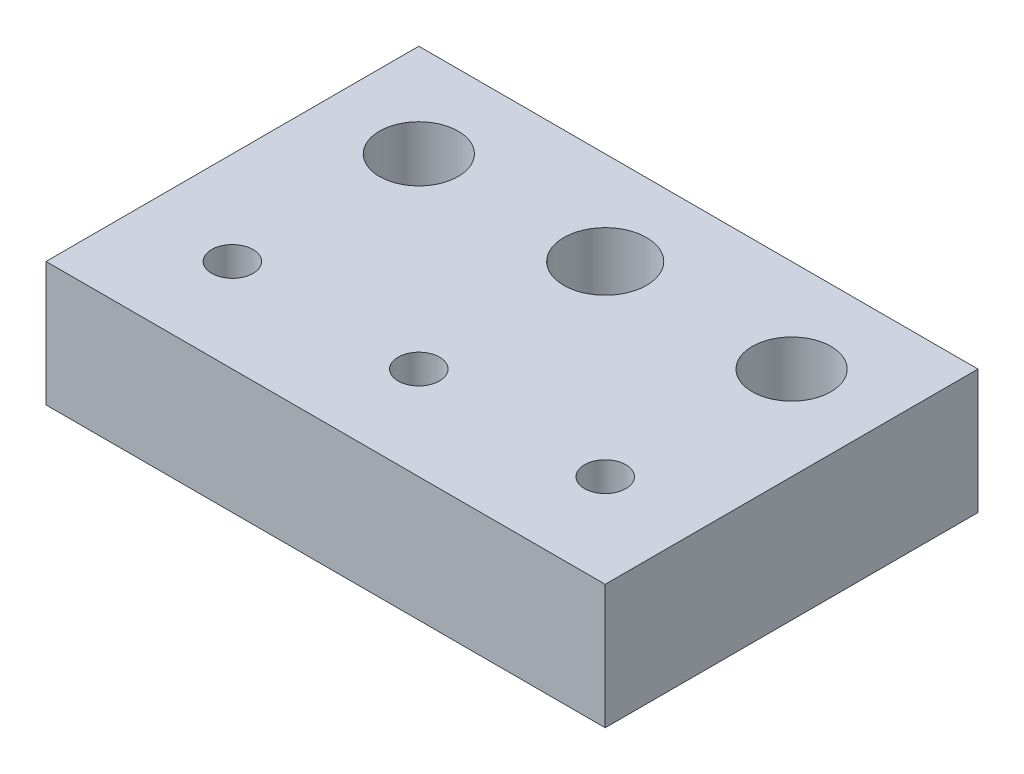
ISO-10303-21;
HEADER;
FILE_DESCRIPTION(('STEP AP214'),'2;1');
FILE_NAME('part.step','',(''),(''),'','','');
FILE_SCHEMA(('AUTOMOTIVE_DESIGN { 1 0 10303 214 1 1 1 1 }'));
ENDSEC;
DATA;
#1=APPLICATION_CONTEXT('core data for automotive mechanical design processes');
#2=APPLICATION_PROTOCOL_DEFINITION('international standard','automotive_design',2000,#1);
#3=PRODUCT_CONTEXT('',#1,'mechanical');
#4=PRODUCT('Part','Part','',(#3));
#5=PRODUCT_RELATED_PRODUCT_CATEGORY('part','',(#4));
#6=PRODUCT_DEFINITION_FORMATION('','',#4);
#7=PRODUCT_DEFINITION_CONTEXT('part definition',#1,'design');
#8=PRODUCT_DEFINITION('design','',#6,#7);
#9=PRODUCT_DEFINITION_SHAPE('','',#8);
#10=(LENGTH_UNIT() NAMED_UNIT(*) SI_UNIT(.MILLI.,.METRE.));
#11=(NAMED_UNIT(*) PLANE_ANGLE_UNIT() SI_UNIT($,.RADIAN.));
#12=(NAMED_UNIT(*) SI_UNIT($,.STERADIAN.) SOLID_ANGLE_UNIT());
#13=UNCERTAINTY_MEASURE_WITH_UNIT(LENGTH_MEASURE(1.E-05),#10,'distance_accuracy_value','');
#14=(GEOMETRIC_REPRESENTATION_CONTEXT(3) GLOBAL_UNCERTAINTY_ASSIGNED_CONTEXT((#13)) GLOBAL_UNIT_ASSIGNED_CONTEXT((#10,
#11,#12)) REPRESENTATION_CONTEXT('',''));
#15=CARTESIAN_POINT('',(0.,0.,0.));
#16=DIRECTION('',(0.,0.,1.));
#17=DIRECTION('',(1.,0.,0.));
#18=AXIS2_PLACEMENT_3D('',#15,#16,#17);
#19=CARTESIAN_POINT('',(0.,30.,22.5));
#20=DIRECTION('',(0.,-1.,0.));
#21=DIRECTION('',(0.,0.,-1.));
#22=AXIS2_PLACEMENT_3D('',#19,#20,#21);
#23=CYLINDRICAL_SURFACE('',#22,5.);
#24=CARTESIAN_POINT('',(0.,30.,22.5));
#25=DIRECTION('',(0.,1.,0.));
#26=DIRECTION('',(0.,0.,1.));
#27=AXIS2_PLACEMENT_3D('',#24,#25,#26);
#28=CIRCLE('',#27,5.);
#29=CARTESIAN_POINT('',(0.,30.,27.5));
#30=VERTEX_POINT('',#29);
#31=EDGE_CURVE('E146',#30,#30,#28,.T.);
#32=ORIENTED_EDGE('',*,*,#31,.T.);
#33=EDGE_LOOP('',(#32));
#34=FACE_BOUND('',#33,.T.);
#35=CARTESIAN_POINT('',(0.,10.,22.5));
#36=DIRECTION('',(0.,-1.,0.));
#37=DIRECTION('',(0.,0.,-1.));
#38=AXIS2_PLACEMENT_3D('',#35,#36,#37);
#39=CIRCLE('',#38,5.);
#40=CARTESIAN_POINT('',(0.,10.,17.5));
#41=VERTEX_POINT('',#40);
#42=EDGE_CURVE('E125',#41,#41,#39,.T.);
#43=ORIENTED_EDGE('',*,*,#42,.T.);
#44=EDGE_LOOP('',(#43));
#45=FACE_BOUND('',#44,.T.);
#46=ADVANCED_FACE('F34',(#34,#45),#23,.F.);
#47=CARTESIAN_POINT('',(45.0000000000002,30.,22.4999999999997));
#48=DIRECTION('',(0.,-1.,0.));
#49=DIRECTION('',(0.,0.,-1.));
#50=AXIS2_PLACEMENT_3D('',#47,#48,#49);
#51=CYLINDRICAL_SURFACE('',#50,5.00000000000001);
#52=CARTESIAN_POINT('',(45.0000000000002,30.,22.4999999999997));
#53=DIRECTION('',(0.,1.,0.));
#54=DIRECTION('',(0.,0.,1.));
#55=AXIS2_PLACEMENT_3D('',#52,#53,#54);
#56=CIRCLE('',#55,5.00000000000001);
#57=CARTESIAN_POINT('',(45.0000000000002,30.,27.4999999999997));
#58=VERTEX_POINT('',#57);
#59=EDGE_CURVE('E105',#58,#58,#56,.F.);
#60=ORIENTED_EDGE('',*,*,#59,.F.);
#61=EDGE_LOOP('',(#60));
#62=FACE_BOUND('',#61,.T.);
#63=CARTESIAN_POINT('',(45.0000000000002,10.,22.4999999999997));
#64=DIRECTION('',(0.,-1.,0.));
#65=DIRECTION('',(0.,0.,-1.));
#66=AXIS2_PLACEMENT_3D('',#63,#64,#65);
#67=CIRCLE('',#66,5.00000000000001);
#68=CARTESIAN_POINT('',(45.0000000000002,10.,17.4999999999997));
#69=VERTEX_POINT('',#68);
#70=EDGE_CURVE('E123',#69,#69,#67,.F.);
#71=ORIENTED_EDGE('',*,*,#70,.F.);
#72=EDGE_LOOP('',(#71));
#73=FACE_BOUND('',#72,.T.);
#74=ADVANCED_FACE('F153',(#62,#73),#51,.F.);
#75=CARTESIAN_POINT('',(0.,30.,0.));
#76=DIRECTION('',(0.,1.,0.));
#77=DIRECTION('',(0.,0.,1.));
#78=AXIS2_PLACEMENT_3D('',#75,#76,#77);
#79=PLANE('',#78);
#80=CARTESIAN_POINT('',(44.9999999999998,30.,-22.5000000000003));
#81=DIRECTION('',(0.,-1.,0.));
#82=DIRECTION('',(0.,0.,-1.));
#83=AXIS2_PLACEMENT_3D('',#80,#81,#82);
#84=CIRCLE('',#83,9.50000000000001);
#85=CARTESIAN_POINT('',(44.9999999999998,30.,-32.0000000000003));
#86=VERTEX_POINT('',#85);
#87=EDGE_CURVE('E135',#86,#86,#84,.T.);
#88=ORIENTED_EDGE('',*,*,#87,.T.);
#89=EDGE_LOOP('',(#88));
#90=FACE_BOUND('',#89,.T.);
#91=CARTESIAN_POINT('',(0.,30.,-22.5));
#92=DIRECTION('',(0.,1.,0.));
#93=DIRECTION('',(0.,0.,1.));
#94=AXIS2_PLACEMENT_3D('',#91,#92,#93);
#95=CIRCLE('',#94,10.);
#96=CARTESIAN_POINT('',(0.,30.,-12.5));
#97=VERTEX_POINT('',#96);
#98=EDGE_CURVE('E120',#97,#97,#95,.T.);
#99=ORIENTED_EDGE('',*,*,#98,.F.);
#100=EDGE_LOOP('',(#99));
#101=FACE_BOUND('',#100,.T.);
#102=ORIENTED_EDGE('',*,*,#31,.F.);
#103=EDGE_LOOP('',(#102));
#104=FACE_BOUND('',#103,.T.);
#105=DIRECTION('',(1.,0.,0.));
#106=VECTOR('',#105,1.);
#107=CARTESIAN_POINT('',(0.,30.,45.));
#108=LINE('',#107,#106);
#109=CARTESIAN_POINT('',(-67.5,30.,45.));
#110=VERTEX_POINT('',#109);
#111=CARTESIAN_POINT('',(67.5,30.,45.));
#112=VERTEX_POINT('',#111);
#113=EDGE_CURVE('E87',#110,#112,#108,.T.);
#114=ORIENTED_EDGE('',*,*,#113,.T.);
#115=DIRECTION('',(0.,0.,-1.));
#116=VECTOR('',#115,1.);
#117=CARTESIAN_POINT('',(67.5,30.,0.));
#118=LINE('',#117,#116);
#119=CARTESIAN_POINT('',(67.5,30.,-45.));
#120=VERTEX_POINT('',#119);
#121=EDGE_CURVE('E78',#112,#120,#118,.T.);
#122=ORIENTED_EDGE('',*,*,#121,.T.);
#123=DIRECTION('',(1.,0.,0.));
#124=VECTOR('',#123,1.);
#125=CARTESIAN_POINT('',(0.,30.,-45.));
#126=LINE('',#125,#124);
#127=CARTESIAN_POINT('',(-67.5,30.,-45.));
#128=VERTEX_POINT('',#127);
#129=EDGE_CURVE('E86',#128,#120,#126,.T.);
#130=ORIENTED_EDGE('',*,*,#129,.F.);
#131=DIRECTION('',(0.,0.,-1.));
#132=VECTOR('',#131,1.);
#133=CARTESIAN_POINT('',(-67.5,30.,0.));
#134=LINE('',#133,#132);
#135=EDGE_CURVE('E97',#110,#128,#134,.T.);
#136=ORIENTED_EDGE('',*,*,#135,.F.);
#137=EDGE_LOOP('',(#114,#122,#130,#136));
#138=FACE_BOUND('',#137,.T.);
#139=CARTESIAN_POINT('',(-45.,30.,22.5));
#140=DIRECTION('',(0.,1.,0.));
#141=DIRECTION('',(0.,0.,1.));
#142=AXIS2_PLACEMENT_3D('',#139,#140,#141);
#143=CIRCLE('',#142,5.);
#144=CARTESIAN_POINT('',(-45.,30.,27.5));
#145=VERTEX_POINT('',#144);
#146=EDGE_CURVE('E99',#145,#145,#143,.T.);
#147=ORIENTED_EDGE('',*,*,#146,.F.);
#148=EDGE_LOOP('',(#147));
#149=FACE_BOUND('',#148,.T.);
#150=ORIENTED_EDGE('',*,*,#59,.T.);
#151=EDGE_LOOP('',(#150));
#152=FACE_BOUND('',#151,.T.);
#153=CARTESIAN_POINT('',(-45.,30.,-22.5));
#154=DIRECTION('',(0.,1.,0.));
#155=DIRECTION('',(0.,0.,1.));
#156=AXIS2_PLACEMENT_3D('',#153,#154,#155);
#157=CIRCLE('',#156,9.5);
#158=CARTESIAN_POINT('',(-45.,30.,-13.));
#159=VERTEX_POINT('',#158);
#160=EDGE_CURVE('E140',#159,#159,#157,.T.);
#161=ORIENTED_EDGE('',*,*,#160,.F.);
#162=EDGE_LOOP('',(#161));
#163=FACE_BOUND('',#162,.T.);
#164=ADVANCED_FACE('F82',(#90,#101,#104,#138,#149,#152,#163),#79,.T.);
#165=CARTESIAN_POINT('',(0.,30.,45.));
#166=DIRECTION('',(0.,0.,-1.));
#167=DIRECTION('',(-1.,0.,0.));
#168=AXIS2_PLACEMENT_3D('',#165,#166,#167);
#169=PLANE('',#168);
#170=DIRECTION('',(1.,0.,0.));
#171=VECTOR('',#170,1.);
#172=CARTESIAN_POINT('',(0.,0.,45.));
#173=LINE('',#172,#171);
#174=CARTESIAN_POINT('',(-67.5,0.,45.));
#175=VERTEX_POINT('',#174);
#176=CARTESIAN_POINT('',(67.5,0.,45.));
#177=VERTEX_POINT('',#176);
#178=EDGE_CURVE('E111',#175,#177,#173,.T.);
#179=ORIENTED_EDGE('',*,*,#178,.T.);
#180=DIRECTION('',(0.,-1.,0.));
#181=VECTOR('',#180,1.);
#182=CARTESIAN_POINT('',(67.5,30.,45.));
#183=LINE('',#182,#181);
#184=EDGE_CURVE('E11',#112,#177,#183,.T.);
#185=ORIENTED_EDGE('',*,*,#184,.F.);
#186=ORIENTED_EDGE('',*,*,#113,.F.);
#187=DIRECTION('',(0.,-1.,0.));
#188=VECTOR('',#187,1.);
#189=CARTESIAN_POINT('',(-67.5,30.,45.));
#190=LINE('',#189,#188);
#191=EDGE_CURVE('E53',#110,#175,#190,.T.);
#192=ORIENTED_EDGE('',*,*,#191,.T.);
#193=EDGE_LOOP('',(#179,#185,#186,#192));
#194=FACE_BOUND('',#193,.T.);
#195=ADVANCED_FACE('F152',(#194),#169,.F.);
#196=CARTESIAN_POINT('',(67.5,30.,0.));
#197=DIRECTION('',(-1.,0.,0.));
#198=DIRECTION('',(0.,0.,1.));
#199=AXIS2_PLACEMENT_3D('',#196,#197,#198);
#200=PLANE('',#199);
#201=DIRECTION('',(0.,0.,-1.));
#202=VECTOR('',#201,1.);
#203=CARTESIAN_POINT('',(67.5,0.,0.));
#204=LINE('',#203,#202);
#205=CARTESIAN_POINT('',(67.5,0.,-45.));
#206=VERTEX_POINT('',#205);
#207=EDGE_CURVE('E92',#177,#206,#204,.T.);
#208=ORIENTED_EDGE('',*,*,#207,.T.);
#209=DIRECTION('',(0.,-1.,0.));
#210=VECTOR('',#209,1.);
#211=CARTESIAN_POINT('',(67.5,30.,-45.));
#212=LINE('',#211,#210);
#213=EDGE_CURVE('E44',#120,#206,#212,.T.);
#214=ORIENTED_EDGE('',*,*,#213,.F.);
#215=ORIENTED_EDGE('',*,*,#121,.F.);
#216=ORIENTED_EDGE('',*,*,#184,.T.);
#217=EDGE_LOOP('',(#208,#214,#215,#216));
#218=FACE_BOUND('',#217,.T.);
#219=ADVANCED_FACE('F91',(#218),#200,.F.);
#220=CARTESIAN_POINT('',(0.,30.,-45.));
#221=DIRECTION('',(0.,0.,-1.));
#222=DIRECTION('',(-1.,0.,0.));
#223=AXIS2_PLACEMENT_3D('',#220,#221,#222);
#224=PLANE('',#223);
#225=DIRECTION('',(1.,0.,0.));
#226=VECTOR('',#225,1.);
#227=CARTESIAN_POINT('',(0.,0.,-45.));
#228=LINE('',#227,#226);
#229=CARTESIAN_POINT('',(-67.5,0.,-45.));
#230=VERTEX_POINT('',#229);
#231=EDGE_CURVE('E115',#230,#206,#228,.T.);
#232=ORIENTED_EDGE('',*,*,#231,.F.);
#233=DIRECTION('',(0.,-1.,0.));
#234=VECTOR('',#233,1.);
#235=CARTESIAN_POINT('',(-67.5,30.,-45.));
#236=LINE('',#235,#234);
#237=EDGE_CURVE('E67',#128,#230,#236,.T.);
#238=ORIENTED_EDGE('',*,*,#237,.F.);
#239=ORIENTED_EDGE('',*,*,#129,.T.);
#240=ORIENTED_EDGE('',*,*,#213,.T.);
#241=EDGE_LOOP('',(#232,#238,#239,#240));
#242=FACE_BOUND('',#241,.T.);
#243=ADVANCED_FACE('F96',(#242),#224,.T.);
#244=CARTESIAN_POINT('',(-45.,30.,22.5));
#245=DIRECTION('',(0.,-1.,0.));
#246=DIRECTION('',(0.,0.,-1.));
#247=AXIS2_PLACEMENT_3D('',#244,#245,#246);
#248=CYLINDRICAL_SURFACE('',#247,5.);
#249=CARTESIAN_POINT('',(-45.,10.,22.5));
#250=DIRECTION('',(0.,1.,0.));
#251=DIRECTION('',(0.,0.,1.));
#252=AXIS2_PLACEMENT_3D('',#249,#250,#251);
#253=CIRCLE('',#252,5.);
#254=CARTESIAN_POINT('',(-45.,10.,27.5));
#255=VERTEX_POINT('',#254);
#256=EDGE_CURVE('E38',#255,#255,#253,.T.);
#257=ORIENTED_EDGE('',*,*,#256,.F.);
#258=EDGE_LOOP('',(#257));
#259=FACE_BOUND('',#258,.T.);
#260=ORIENTED_EDGE('',*,*,#146,.T.);
#261=EDGE_LOOP('',(#260));
#262=FACE_BOUND('',#261,.T.);
#263=ADVANCED_FACE('F174',(#259,#262),#248,.F.);
#264=CARTESIAN_POINT('',(-67.5,30.,0.));
#265=DIRECTION('',(-1.,0.,0.));
#266=DIRECTION('',(0.,0.,1.));
#267=AXIS2_PLACEMENT_3D('',#264,#265,#266);
#268=PLANE('',#267);
#269=DIRECTION('',(0.,0.,-1.));
#270=VECTOR('',#269,1.);
#271=CARTESIAN_POINT('',(-67.5,0.,0.));
#272=LINE('',#271,#270);
#273=EDGE_CURVE('E117',#175,#230,#272,.T.);
#274=ORIENTED_EDGE('',*,*,#273,.F.);
#275=ORIENTED_EDGE('',*,*,#191,.F.);
#276=ORIENTED_EDGE('',*,*,#135,.T.);
#277=ORIENTED_EDGE('',*,*,#237,.T.);
#278=EDGE_LOOP('',(#274,#275,#276,#277));
#279=FACE_BOUND('',#278,.T.);
#280=ADVANCED_FACE('F175',(#279),#268,.T.);
#281=CARTESIAN_POINT('',(0.,30.,-22.5));
#282=DIRECTION('',(0.,-1.,0.));
#283=DIRECTION('',(0.,0.,-1.));
#284=AXIS2_PLACEMENT_3D('',#281,#282,#283);
#285=CYLINDRICAL_SURFACE('',#284,10.);
#286=ORIENTED_EDGE('',*,*,#98,.T.);
#287=EDGE_LOOP('',(#286));
#288=FACE_BOUND('',#287,.T.);
#289=CARTESIAN_POINT('',(0.,0.,-22.5));
#290=DIRECTION('',(0.,1.,0.));
#291=DIRECTION('',(0.,0.,1.));
#292=AXIS2_PLACEMENT_3D('',#289,#290,#291);
#293=CIRCLE('',#292,10.);
#294=CARTESIAN_POINT('',(0.,0.,-12.5));
#295=VERTEX_POINT('',#294);
#296=EDGE_CURVE('E108',#295,#295,#293,.T.);
#297=ORIENTED_EDGE('',*,*,#296,.F.);
#298=EDGE_LOOP('',(#297));
#299=FACE_BOUND('',#298,.T.);
#300=ADVANCED_FACE('F36',(#288,#299),#285,.F.);
#301=CARTESIAN_POINT('',(0.,0.,0.));
#302=DIRECTION('',(0.,1.,0.));
#303=DIRECTION('',(0.,0.,1.));
#304=AXIS2_PLACEMENT_3D('',#301,#302,#303);
#305=PLANE('',#304);
#306=CARTESIAN_POINT('',(-45.0000000000001,0.,22.4999999999997));
#307=DIRECTION('',(0.,-1.,0.));
#308=DIRECTION('',(0.,0.,1.));
#309=AXIS2_PLACEMENT_3D('',#306,#307,#308);
#310=CIRCLE('',#309,8.00000000000001);
#311=CARTESIAN_POINT('',(-45.0000000000001,0.,30.4999999999997));
#312=VERTEX_POINT('',#311);
#313=EDGE_CURVE('E194',#312,#312,#310,.T.);
#314=ORIENTED_EDGE('',*,*,#313,.F.);
#315=EDGE_LOOP('',(#314));
#316=FACE_BOUND('',#315,.T.);
#317=CARTESIAN_POINT('',(44.9999999999999,0.,22.5));
#318=DIRECTION('',(0.,-1.,0.));
#319=DIRECTION('',(0.,0.,-1.));
#320=AXIS2_PLACEMENT_3D('',#317,#318,#319);
#321=CIRCLE('',#320,8.);
#322=CARTESIAN_POINT('',(44.9999999999999,0.,14.5));
#323=VERTEX_POINT('',#322);
#324=EDGE_CURVE('E198',#323,#323,#321,.T.);
#325=ORIENTED_EDGE('',*,*,#324,.F.);
#326=EDGE_LOOP('',(#325));
#327=FACE_BOUND('',#326,.T.);
#328=CARTESIAN_POINT('',(0.,0.,22.5));
#329=DIRECTION('',(0.,-1.,0.));
#330=DIRECTION('',(0.,0.,-1.));
#331=AXIS2_PLACEMENT_3D('',#328,#329,#330);
#332=CIRCLE('',#331,8.);
#333=CARTESIAN_POINT('',(0.,0.,14.5));
#334=VERTEX_POINT('',#333);
#335=EDGE_CURVE('E202',#334,#334,#332,.T.);
#336=ORIENTED_EDGE('',*,*,#335,.F.);
#337=EDGE_LOOP('',(#336));
#338=FACE_BOUND('',#337,.T.);
#339=ORIENTED_EDGE('',*,*,#296,.T.);
#340=EDGE_LOOP('',(#339));
#341=FACE_BOUND('',#340,.T.);
#342=ORIENTED_EDGE('',*,*,#178,.F.);
#343=ORIENTED_EDGE('',*,*,#273,.T.);
#344=ORIENTED_EDGE('',*,*,#231,.T.);
#345=ORIENTED_EDGE('',*,*,#207,.F.);
#346=EDGE_LOOP('',(#342,#343,#344,#345));
#347=FACE_BOUND('',#346,.T.);
#348=ADVANCED_FACE('F180',(#316,#327,#338,#341,#347),#305,.F.);
#349=CARTESIAN_POINT('',(44.9999999999998,10.,-22.5000000000003));
#350=DIRECTION('',(0.,1.,0.));
#351=DIRECTION('',(0.,0.,1.));
#352=AXIS2_PLACEMENT_3D('',#349,#350,#351);
#353=CYLINDRICAL_SURFACE('',#352,9.50000000000001);
#354=CARTESIAN_POINT('',(44.9999999999998,10.,-22.5000000000003));
#355=DIRECTION('',(0.,-1.,0.));
#356=DIRECTION('',(0.,0.,-1.));
#357=AXIS2_PLACEMENT_3D('',#354,#355,#356);
#358=CIRCLE('',#357,9.50000000000001);
#359=CARTESIAN_POINT('',(44.9999999999998,10.,-32.0000000000003));
#360=VERTEX_POINT('',#359);
#361=EDGE_CURVE('E131',#360,#360,#358,.T.);
#362=ORIENTED_EDGE('',*,*,#361,.T.);
#363=EDGE_LOOP('',(#362));
#364=FACE_BOUND('',#363,.T.);
#365=ORIENTED_EDGE('',*,*,#87,.F.);
#366=EDGE_LOOP('',(#365));
#367=FACE_BOUND('',#366,.T.);
#368=ADVANCED_FACE('F182',(#364,#367),#353,.F.);
#369=CARTESIAN_POINT('',(44.9999999999998,10.,-22.5000000000003));
#370=DIRECTION('',(0.,-1.,0.));
#371=DIRECTION('',(0.,0.,-1.));
#372=AXIS2_PLACEMENT_3D('',#369,#370,#371);
#373=PLANE('',#372);
#374=ORIENTED_EDGE('',*,*,#361,.F.);
#375=EDGE_LOOP('',(#374));
#376=FACE_BOUND('',#375,.T.);
#377=ADVANCED_FACE('F188',(#376),#373,.F.);
#378=CARTESIAN_POINT('',(-45.,10.,-22.5));
#379=DIRECTION('',(0.,1.,0.));
#380=DIRECTION('',(0.,0.,1.));
#381=AXIS2_PLACEMENT_3D('',#378,#379,#380);
#382=CYLINDRICAL_SURFACE('',#381,9.5);
#383=CARTESIAN_POINT('',(-45.,10.,-22.5));
#384=DIRECTION('',(0.,1.,0.));
#385=DIRECTION('',(0.,0.,1.));
#386=AXIS2_PLACEMENT_3D('',#383,#384,#385);
#387=CIRCLE('',#386,9.5);
#388=CARTESIAN_POINT('',(-45.,10.,-13.));
#389=VERTEX_POINT('',#388);
#390=EDGE_CURVE('E112',#389,#389,#387,.T.);
#391=ORIENTED_EDGE('',*,*,#390,.F.);
#392=EDGE_LOOP('',(#391));
#393=FACE_BOUND('',#392,.T.);
#394=ORIENTED_EDGE('',*,*,#160,.T.);
#395=EDGE_LOOP('',(#394));
#396=FACE_BOUND('',#395,.T.);
#397=ADVANCED_FACE('F219',(#393,#396),#382,.F.);
#398=CARTESIAN_POINT('',(-45.,10.,-22.5));
#399=DIRECTION('',(0.,1.,0.));
#400=DIRECTION('',(0.,0.,1.));
#401=AXIS2_PLACEMENT_3D('',#398,#399,#400);
#402=PLANE('',#401);
#403=ORIENTED_EDGE('',*,*,#390,.T.);
#404=EDGE_LOOP('',(#403));
#405=FACE_BOUND('',#404,.T.);
#406=ADVANCED_FACE('F222',(#405),#402,.T.);
#407=CARTESIAN_POINT('',(0.,10.,22.5));
#408=DIRECTION('',(0.,-1.,0.));
#409=DIRECTION('',(0.,0.,-1.));
#410=AXIS2_PLACEMENT_3D('',#407,#408,#409);
#411=CYLINDRICAL_SURFACE('',#410,8.);
#412=CARTESIAN_POINT('',(0.,10.,22.5));
#413=DIRECTION('',(0.,-1.,0.));
#414=DIRECTION('',(0.,0.,-1.));
#415=AXIS2_PLACEMENT_3D('',#412,#413,#414);
#416=CIRCLE('',#415,8.);
#417=CARTESIAN_POINT('',(0.,10.,14.5));
#418=VERTEX_POINT('',#417);
#419=EDGE_CURVE('E126',#418,#418,#416,.T.);
#420=ORIENTED_EDGE('',*,*,#419,.F.);
#421=EDGE_LOOP('',(#420));
#422=FACE_BOUND('',#421,.T.);
#423=ORIENTED_EDGE('',*,*,#335,.T.);
#424=EDGE_LOOP('',(#423));
#425=FACE_BOUND('',#424,.T.);
#426=ADVANCED_FACE('F229',(#422,#425),#411,.F.);
#427=CARTESIAN_POINT('',(0.,10.,22.5));
#428=DIRECTION('',(0.,-1.,0.));
#429=DIRECTION('',(0.,0.,-1.));
#430=AXIS2_PLACEMENT_3D('',#427,#428,#429);
#431=PLANE('',#430);
#432=ORIENTED_EDGE('',*,*,#42,.F.);
#433=EDGE_LOOP('',(#432));
#434=FACE_BOUND('',#433,.T.);
#435=ORIENTED_EDGE('',*,*,#419,.T.);
#436=EDGE_LOOP('',(#435));
#437=FACE_BOUND('',#436,.T.);
#438=ADVANCED_FACE('F237',(#434,#437),#431,.T.);
#439=CARTESIAN_POINT('',(44.9999999999999,10.,22.5));
#440=DIRECTION('',(0.,-1.,0.));
#441=DIRECTION('',(0.,0.,-1.));
#442=AXIS2_PLACEMENT_3D('',#439,#440,#441);
#443=PLANE('',#442);
#444=CARTESIAN_POINT('',(44.9999999999999,10.,22.5));
#445=DIRECTION('',(0.,-1.,0.));
#446=DIRECTION('',(0.,0.,-1.));
#447=AXIS2_PLACEMENT_3D('',#444,#445,#446);
#448=CIRCLE('',#447,8.);
#449=CARTESIAN_POINT('',(44.9999999999999,10.,14.5));
#450=VERTEX_POINT('',#449);
#451=EDGE_CURVE('E207',#450,#450,#448,.T.);
#452=ORIENTED_EDGE('',*,*,#451,.T.);
#453=EDGE_LOOP('',(#452));
#454=FACE_BOUND('',#453,.T.);
#455=ORIENTED_EDGE('',*,*,#70,.T.);
#456=EDGE_LOOP('',(#455));
#457=FACE_BOUND('',#456,.T.);
#458=ADVANCED_FACE('F241',(#454,#457),#443,.T.);
#459=CARTESIAN_POINT('',(44.9999999999999,10.,22.5));
#460=DIRECTION('',(0.,-1.,0.));
#461=DIRECTION('',(0.,0.,-1.));
#462=AXIS2_PLACEMENT_3D('',#459,#460,#461);
#463=CYLINDRICAL_SURFACE('',#462,8.);
#464=ORIENTED_EDGE('',*,*,#451,.F.);
#465=EDGE_LOOP('',(#464));
#466=FACE_BOUND('',#465,.T.);
#467=ORIENTED_EDGE('',*,*,#324,.T.);
#468=EDGE_LOOP('',(#467));
#469=FACE_BOUND('',#468,.T.);
#470=ADVANCED_FACE('F247',(#466,#469),#463,.F.);
#471=CARTESIAN_POINT('',(-45.0000000000001,10.,22.4999999999997));
#472=DIRECTION('',(0.,-1.,0.));
#473=DIRECTION('',(0.,0.,-1.));
#474=AXIS2_PLACEMENT_3D('',#471,#472,#473);
#475=CYLINDRICAL_SURFACE('',#474,8.00000000000001);
#476=CARTESIAN_POINT('',(-45.0000000000001,10.,22.4999999999997));
#477=DIRECTION('',(0.,-1.,0.));
#478=DIRECTION('',(0.,0.,1.));
#479=AXIS2_PLACEMENT_3D('',#476,#477,#478);
#480=CIRCLE('',#479,8.00000000000001);
#481=CARTESIAN_POINT('',(-45.0000000000001,10.,30.4999999999997));
#482=VERTEX_POINT('',#481);
#483=EDGE_CURVE('E263',#482,#482,#480,.T.);
#484=ORIENTED_EDGE('',*,*,#483,.F.);
#485=EDGE_LOOP('',(#484));
#486=FACE_BOUND('',#485,.T.);
#487=ORIENTED_EDGE('',*,*,#313,.T.);
#488=EDGE_LOOP('',(#487));
#489=FACE_BOUND('',#488,.T.);
#490=ADVANCED_FACE('F243',(#486,#489),#475,.F.);
#491=CARTESIAN_POINT('',(-45.0000000000001,10.,22.4999999999997));
#492=DIRECTION('',(0.,1.,0.));
#493=DIRECTION('',(0.,0.,1.));
#494=AXIS2_PLACEMENT_3D('',#491,#492,#493);
#495=PLANE('',#494);
#496=ORIENTED_EDGE('',*,*,#256,.T.);
#497=EDGE_LOOP('',(#496));
#498=FACE_BOUND('',#497,.T.);
#499=ORIENTED_EDGE('',*,*,#483,.T.);
#500=EDGE_LOOP('',(#499));
#501=FACE_BOUND('',#500,.T.);
#502=ADVANCED_FACE('F246',(#498,#501),#495,.F.);
#503=CLOSED_SHELL('',(#46,#74,#164,#195,#219,#243,#263,#280,#300,#348,#368,#377,#397,#406,#426,
#438,#458,#470,#490,#502));
#504=MANIFOLD_SOLID_BREP('B2',#503);
#505=ADVANCED_BREP_SHAPE_REPRESENTATION('',(#18,#504),#14);
#506=SHAPE_DEFINITION_REPRESENTATION(#9,#505);
ENDSEC;
END-ISO-10303-21;
